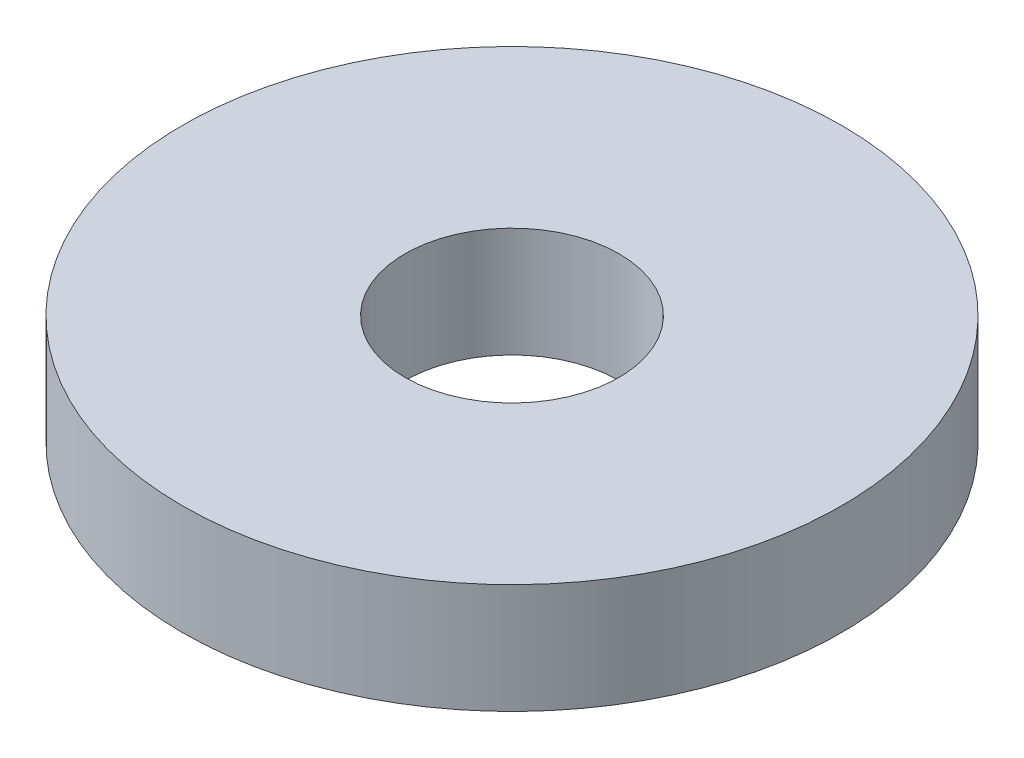
ISO-10303-21;
HEADER;
FILE_DESCRIPTION(('STEP AP214'),'2;1');
FILE_NAME('part.step','',(''),(''),'','','');
FILE_SCHEMA(('AUTOMOTIVE_DESIGN { 1 0 10303 214 1 1 1 1 }'));
ENDSEC;
DATA;
#1=APPLICATION_CONTEXT('core data for automotive mechanical design processes');
#2=APPLICATION_PROTOCOL_DEFINITION('international standard','automotive_design',2000,#1);
#3=PRODUCT_CONTEXT('',#1,'mechanical');
#4=PRODUCT('Part','Part','',(#3));
#5=PRODUCT_RELATED_PRODUCT_CATEGORY('part','',(#4));
#6=PRODUCT_DEFINITION_FORMATION('','',#4);
#7=PRODUCT_DEFINITION_CONTEXT('part definition',#1,'design');
#8=PRODUCT_DEFINITION('design','',#6,#7);
#9=PRODUCT_DEFINITION_SHAPE('','',#8);
#10=(LENGTH_UNIT() NAMED_UNIT(*) SI_UNIT(.MILLI.,.METRE.));
#11=(NAMED_UNIT(*) PLANE_ANGLE_UNIT() SI_UNIT($,.RADIAN.));
#12=(NAMED_UNIT(*) SI_UNIT($,.STERADIAN.) SOLID_ANGLE_UNIT());
#13=UNCERTAINTY_MEASURE_WITH_UNIT(LENGTH_MEASURE(1.E-05),#10,'distance_accuracy_value','');
#14=(GEOMETRIC_REPRESENTATION_CONTEXT(3) GLOBAL_UNCERTAINTY_ASSIGNED_CONTEXT((#13)) GLOBAL_UNIT_ASSIGNED_CONTEXT((#10,
#11,#12)) REPRESENTATION_CONTEXT('',''));
#15=CARTESIAN_POINT('',(0.,0.,0.));
#16=DIRECTION('',(0.,0.,1.));
#17=DIRECTION('',(1.,0.,0.));
#18=AXIS2_PLACEMENT_3D('',#15,#16,#17);
#19=CARTESIAN_POINT('',(0.,2.,0.));
#20=DIRECTION('',(0.,1.,0.));
#21=DIRECTION('',(0.,0.,1.));
#22=AXIS2_PLACEMENT_3D('',#19,#20,#21);
#23=PLANE('',#22);
#24=CARTESIAN_POINT('',(0.,2.,0.));
#25=DIRECTION('',(0.,1.,0.));
#26=DIRECTION('',(0.,0.,1.));
#27=AXIS2_PLACEMENT_3D('',#24,#25,#26);
#28=CIRCLE('',#27,6.);
#29=CARTESIAN_POINT('',(0.,2.,6.));
#30=VERTEX_POINT('',#29);
#31=EDGE_CURVE('E10',#30,#30,#28,.T.);
#32=ORIENTED_EDGE('',*,*,#31,.T.);
#33=EDGE_LOOP('',(#32));
#34=FACE_BOUND('',#33,.T.);
#35=CARTESIAN_POINT('',(0.,2.,0.));
#36=DIRECTION('',(0.,1.,0.));
#37=DIRECTION('',(0.,0.,1.));
#38=AXIS2_PLACEMENT_3D('',#35,#36,#37);
#39=CIRCLE('',#38,1.95);
#40=CARTESIAN_POINT('',(0.,2.,1.95));
#41=VERTEX_POINT('',#40);
#42=EDGE_CURVE('E48',#41,#41,#39,.T.);
#43=ORIENTED_EDGE('',*,*,#42,.F.);
#44=EDGE_LOOP('',(#43));
#45=FACE_BOUND('',#44,.T.);
#46=ADVANCED_FACE('F37',(#34,#45),#23,.T.);
#47=CARTESIAN_POINT('',(0.,0.,0.));
#48=DIRECTION('',(0.,1.,0.));
#49=DIRECTION('',(0.,0.,1.));
#50=AXIS2_PLACEMENT_3D('',#47,#48,#49);
#51=PLANE('',#50);
#52=CARTESIAN_POINT('',(0.,0.,0.));
#53=DIRECTION('',(0.,1.,0.));
#54=DIRECTION('',(0.,0.,1.));
#55=AXIS2_PLACEMENT_3D('',#52,#53,#54);
#56=CIRCLE('',#55,6.);
#57=CARTESIAN_POINT('',(0.,0.,6.));
#58=VERTEX_POINT('',#57);
#59=EDGE_CURVE('E41',#58,#58,#56,.T.);
#60=ORIENTED_EDGE('',*,*,#59,.F.);
#61=EDGE_LOOP('',(#60));
#62=FACE_BOUND('',#61,.T.);
#63=CARTESIAN_POINT('',(0.,0.,0.));
#64=DIRECTION('',(0.,1.,0.));
#65=DIRECTION('',(0.,0.,1.));
#66=AXIS2_PLACEMENT_3D('',#63,#64,#65);
#67=CIRCLE('',#66,1.95);
#68=CARTESIAN_POINT('',(0.,0.,1.95));
#69=VERTEX_POINT('',#68);
#70=EDGE_CURVE('E50',#69,#69,#67,.T.);
#71=ORIENTED_EDGE('',*,*,#70,.T.);
#72=EDGE_LOOP('',(#71));
#73=FACE_BOUND('',#72,.T.);
#74=ADVANCED_FACE('F60',(#62,#73),#51,.F.);
#75=CARTESIAN_POINT('',(0.,2.,0.));
#76=DIRECTION('',(0.,-1.,0.));
#77=DIRECTION('',(0.,0.,-1.));
#78=AXIS2_PLACEMENT_3D('',#75,#76,#77);
#79=CYLINDRICAL_SURFACE('',#78,6.);
#80=ORIENTED_EDGE('',*,*,#31,.F.);
#81=EDGE_LOOP('',(#80));
#82=FACE_BOUND('',#81,.T.);
#83=ORIENTED_EDGE('',*,*,#59,.T.);
#84=EDGE_LOOP('',(#83));
#85=FACE_BOUND('',#84,.T.);
#86=ADVANCED_FACE('F39',(#82,#85),#79,.T.);
#87=CARTESIAN_POINT('',(0.,2.,0.));
#88=DIRECTION('',(0.,-1.,0.));
#89=DIRECTION('',(0.,0.,-1.));
#90=AXIS2_PLACEMENT_3D('',#87,#88,#89);
#91=CYLINDRICAL_SURFACE('',#90,1.95);
#92=ORIENTED_EDGE('',*,*,#42,.T.);
#93=EDGE_LOOP('',(#92));
#94=FACE_BOUND('',#93,.T.);
#95=ORIENTED_EDGE('',*,*,#70,.F.);
#96=EDGE_LOOP('',(#95));
#97=FACE_BOUND('',#96,.T.);
#98=ADVANCED_FACE('F56',(#94,#97),#91,.F.);
#99=CLOSED_SHELL('',(#46,#74,#86,#98));
#100=MANIFOLD_SOLID_BREP('B2',#99);
#101=ADVANCED_BREP_SHAPE_REPRESENTATION('',(#18,#100),#14);
#102=SHAPE_DEFINITION_REPRESENTATION(#9,#101);
ENDSEC;
END-ISO-10303-21;
